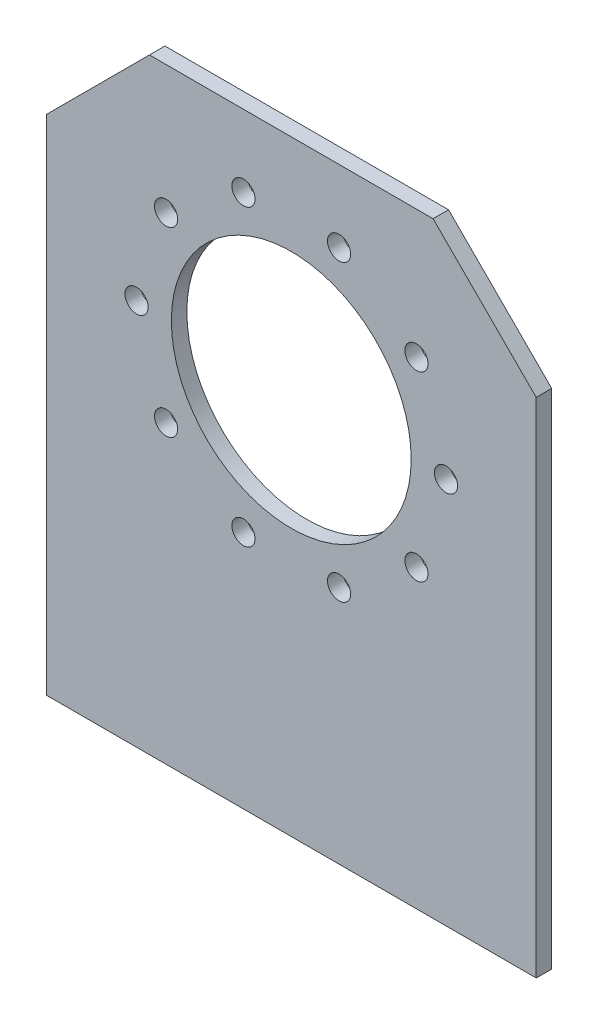
ISO-10303-21;
HEADER;
FILE_DESCRIPTION(('STEP AP214'),'2;1');
FILE_NAME('part.step','',(''),(''),'','','');
FILE_SCHEMA(('AUTOMOTIVE_DESIGN { 1 0 10303 214 1 1 1 1 }'));
ENDSEC;
DATA;
#1=APPLICATION_CONTEXT('core data for automotive mechanical design processes');
#2=APPLICATION_PROTOCOL_DEFINITION('international standard','automotive_design',2000,#1);
#3=PRODUCT_CONTEXT('',#1,'mechanical');
#4=PRODUCT('Part','Part','',(#3));
#5=PRODUCT_RELATED_PRODUCT_CATEGORY('part','',(#4));
#6=PRODUCT_DEFINITION_FORMATION('','',#4);
#7=PRODUCT_DEFINITION_CONTEXT('part definition',#1,'design');
#8=PRODUCT_DEFINITION('design','',#6,#7);
#9=PRODUCT_DEFINITION_SHAPE('','',#8);
#10=(LENGTH_UNIT() NAMED_UNIT(*) SI_UNIT(.MILLI.,.METRE.));
#11=(NAMED_UNIT(*) PLANE_ANGLE_UNIT() SI_UNIT($,.RADIAN.));
#12=(NAMED_UNIT(*) SI_UNIT($,.STERADIAN.) SOLID_ANGLE_UNIT());
#13=UNCERTAINTY_MEASURE_WITH_UNIT(LENGTH_MEASURE(1.E-05),#10,'distance_accuracy_value','');
#14=(GEOMETRIC_REPRESENTATION_CONTEXT(3) GLOBAL_UNCERTAINTY_ASSIGNED_CONTEXT((#13)) GLOBAL_UNIT_ASSIGNED_CONTEXT((#10,
#11,#12)) REPRESENTATION_CONTEXT('',''));
#15=CARTESIAN_POINT('',(0.,0.,0.));
#16=DIRECTION('',(0.,0.,1.));
#17=DIRECTION('',(1.,0.,0.));
#18=AXIS2_PLACEMENT_3D('',#15,#16,#17);
#19=CARTESIAN_POINT('',(0.,0.,6.));
#20=DIRECTION('',(0.,0.,-1.));
#21=DIRECTION('',(-1.,0.,0.));
#22=AXIS2_PLACEMENT_3D('',#19,#20,#21);
#23=PLANE('',#22);
#24=DIRECTION('',(0.,-1.,0.));
#25=VECTOR('',#24,1.);
#26=CARTESIAN_POINT('',(-95.,-117.5,6.));
#27=LINE('',#26,#25);
#28=CARTESIAN_POINT('',(-95.,77.5,6.));
#29=VERTEX_POINT('',#28);
#30=CARTESIAN_POINT('',(-95.,-117.5,6.));
#31=VERTEX_POINT('',#30);
#32=EDGE_CURVE('E152',#29,#31,#27,.T.);
#33=ORIENTED_EDGE('',*,*,#32,.T.);
#34=DIRECTION('',(1.,0.,0.));
#35=VECTOR('',#34,1.);
#36=CARTESIAN_POINT('',(-95.,-117.5,6.));
#37=LINE('',#36,#35);
#38=CARTESIAN_POINT('',(95.,-117.5,6.));
#39=VERTEX_POINT('',#38);
#40=EDGE_CURVE('E100',#31,#39,#37,.T.);
#41=ORIENTED_EDGE('',*,*,#40,.T.);
#42=DIRECTION('',(0.,1.,0.));
#43=VECTOR('',#42,1.);
#44=CARTESIAN_POINT('',(95.,-117.5,6.));
#45=LINE('',#44,#43);
#46=CARTESIAN_POINT('',(95.,77.5,6.));
#47=VERTEX_POINT('',#46);
#48=EDGE_CURVE('E113',#39,#47,#45,.T.);
#49=ORIENTED_EDGE('',*,*,#48,.T.);
#50=DIRECTION('',(-0.707106781186547,0.707106781186548,0.));
#51=VECTOR('',#50,1.);
#52=CARTESIAN_POINT('',(55.,117.5,6.));
#53=LINE('',#52,#51);
#54=CARTESIAN_POINT('',(55.,117.5,6.));
#55=VERTEX_POINT('',#54);
#56=EDGE_CURVE('E107',#47,#55,#53,.T.);
#57=ORIENTED_EDGE('',*,*,#56,.T.);
#58=DIRECTION('',(-1.,0.,0.));
#59=VECTOR('',#58,1.);
#60=CARTESIAN_POINT('',(-55.,117.5,6.));
#61=LINE('',#60,#59);
#62=CARTESIAN_POINT('',(-55.,117.5,6.));
#63=VERTEX_POINT('',#62);
#64=EDGE_CURVE('E111',#55,#63,#61,.T.);
#65=ORIENTED_EDGE('',*,*,#64,.T.);
#66=DIRECTION('',(-0.707106781186548,-0.707106781186547,0.));
#67=VECTOR('',#66,1.);
#68=CARTESIAN_POINT('',(-95.,77.5,6.));
#69=LINE('',#68,#67);
#70=EDGE_CURVE('E63',#63,#29,#69,.T.);
#71=ORIENTED_EDGE('',*,*,#70,.T.);
#72=EDGE_LOOP('',(#33,#41,#49,#57,#65,#71));
#73=FACE_BOUND('',#72,.T.);
#74=CARTESIAN_POINT('',(-60.,32.5,6.));
#75=DIRECTION('',(0.,0.,1.));
#76=DIRECTION('',(1.,0.,0.));
#77=AXIS2_PLACEMENT_3D('',#74,#75,#76);
#78=CIRCLE('',#77,4.50000000000001);
#79=CARTESIAN_POINT('',(-55.5,32.5,6.));
#80=VERTEX_POINT('',#79);
#81=EDGE_CURVE('E140',#80,#80,#78,.T.);
#82=ORIENTED_EDGE('',*,*,#81,.F.);
#83=EDGE_LOOP('',(#82));
#84=FACE_BOUND('',#83,.T.);
#85=CARTESIAN_POINT('',(0.,32.5,6.));
#86=DIRECTION('',(0.,0.,1.));
#87=DIRECTION('',(1.,0.,0.));
#88=AXIS2_PLACEMENT_3D('',#85,#86,#87);
#89=CIRCLE('',#88,46.5);
#90=CARTESIAN_POINT('',(46.5,32.5,6.));
#91=VERTEX_POINT('',#90);
#92=EDGE_CURVE('E308',#91,#91,#89,.T.);
#93=ORIENTED_EDGE('',*,*,#92,.F.);
#94=EDGE_LOOP('',(#93));
#95=FACE_BOUND('',#94,.T.);
#96=CARTESIAN_POINT('',(-48.5410196624968,67.7671151375484,6.));
#97=DIRECTION('',(0.,0.,1.));
#98=DIRECTION('',(1.,0.,0.));
#99=AXIS2_PLACEMENT_3D('',#96,#97,#98);
#100=CIRCLE('',#99,4.50000000000001);
#101=CARTESIAN_POINT('',(-44.0410196624968,67.7671151375484,6.));
#102=VERTEX_POINT('',#101);
#103=EDGE_CURVE('E300',#102,#102,#100,.T.);
#104=ORIENTED_EDGE('',*,*,#103,.F.);
#105=EDGE_LOOP('',(#104));
#106=FACE_BOUND('',#105,.T.);
#107=CARTESIAN_POINT('',(-18.5410196624968,89.5633909777092,6.));
#108=DIRECTION('',(0.,0.,1.));
#109=DIRECTION('',(1.,0.,0.));
#110=AXIS2_PLACEMENT_3D('',#107,#108,#109);
#111=CIRCLE('',#110,4.50000000000001);
#112=CARTESIAN_POINT('',(-14.0410196624968,89.5633909777092,6.));
#113=VERTEX_POINT('',#112);
#114=EDGE_CURVE('E292',#113,#113,#111,.T.);
#115=ORIENTED_EDGE('',*,*,#114,.F.);
#116=EDGE_LOOP('',(#115));
#117=FACE_BOUND('',#116,.T.);
#118=CARTESIAN_POINT('',(18.5410196624968,89.5633909777092,6.));
#119=DIRECTION('',(0.,0.,1.));
#120=DIRECTION('',(1.,0.,0.));
#121=AXIS2_PLACEMENT_3D('',#118,#119,#120);
#122=CIRCLE('',#121,4.50000000000001);
#123=CARTESIAN_POINT('',(23.0410196624969,89.5633909777092,6.));
#124=VERTEX_POINT('',#123);
#125=EDGE_CURVE('E284',#124,#124,#122,.T.);
#126=ORIENTED_EDGE('',*,*,#125,.F.);
#127=EDGE_LOOP('',(#126));
#128=FACE_BOUND('',#127,.T.);
#129=CARTESIAN_POINT('',(48.5410196624968,67.7671151375484,6.));
#130=DIRECTION('',(0.,0.,1.));
#131=DIRECTION('',(1.,0.,0.));
#132=AXIS2_PLACEMENT_3D('',#129,#130,#131);
#133=CIRCLE('',#132,4.50000000000001);
#134=CARTESIAN_POINT('',(53.0410196624969,67.7671151375484,6.));
#135=VERTEX_POINT('',#134);
#136=EDGE_CURVE('E276',#135,#135,#133,.T.);
#137=ORIENTED_EDGE('',*,*,#136,.F.);
#138=EDGE_LOOP('',(#137));
#139=FACE_BOUND('',#138,.T.);
#140=CARTESIAN_POINT('',(60.,32.5,6.));
#141=DIRECTION('',(0.,0.,1.));
#142=DIRECTION('',(1.,0.,0.));
#143=AXIS2_PLACEMENT_3D('',#140,#141,#142);
#144=CIRCLE('',#143,4.50000000000002);
#145=CARTESIAN_POINT('',(64.5,32.5,6.));
#146=VERTEX_POINT('',#145);
#147=EDGE_CURVE('E268',#146,#146,#144,.T.);
#148=ORIENTED_EDGE('',*,*,#147,.F.);
#149=EDGE_LOOP('',(#148));
#150=FACE_BOUND('',#149,.T.);
#151=CARTESIAN_POINT('',(48.5410196624969,-2.76711513754838,6.));
#152=DIRECTION('',(0.,0.,1.));
#153=DIRECTION('',(1.,0.,0.));
#154=AXIS2_PLACEMENT_3D('',#151,#152,#153);
#155=CIRCLE('',#154,4.5);
#156=CARTESIAN_POINT('',(53.0410196624969,-2.76711513754838,6.));
#157=VERTEX_POINT('',#156);
#158=EDGE_CURVE('E260',#157,#157,#155,.T.);
#159=ORIENTED_EDGE('',*,*,#158,.F.);
#160=EDGE_LOOP('',(#159));
#161=FACE_BOUND('',#160,.T.);
#162=CARTESIAN_POINT('',(18.5410196624969,-24.5633909777092,6.));
#163=DIRECTION('',(0.,0.,1.));
#164=DIRECTION('',(1.,0.,0.));
#165=AXIS2_PLACEMENT_3D('',#162,#163,#164);
#166=CIRCLE('',#165,4.5);
#167=CARTESIAN_POINT('',(23.0410196624969,-24.5633909777092,6.));
#168=VERTEX_POINT('',#167);
#169=EDGE_CURVE('E252',#168,#168,#166,.T.);
#170=ORIENTED_EDGE('',*,*,#169,.F.);
#171=EDGE_LOOP('',(#170));
#172=FACE_BOUND('',#171,.T.);
#173=CARTESIAN_POINT('',(-18.5410196624968,-24.5633909777092,6.));
#174=DIRECTION('',(0.,0.,1.));
#175=DIRECTION('',(1.,0.,0.));
#176=AXIS2_PLACEMENT_3D('',#173,#174,#175);
#177=CIRCLE('',#176,4.5);
#178=CARTESIAN_POINT('',(-14.0410196624968,-24.5633909777092,6.));
#179=VERTEX_POINT('',#178);
#180=EDGE_CURVE('E244',#179,#179,#177,.T.);
#181=ORIENTED_EDGE('',*,*,#180,.F.);
#182=EDGE_LOOP('',(#181));
#183=FACE_BOUND('',#182,.T.);
#184=CARTESIAN_POINT('',(-48.5410196624968,-2.7671151375484,6.));
#185=DIRECTION('',(0.,0.,1.));
#186=DIRECTION('',(1.,0.,0.));
#187=AXIS2_PLACEMENT_3D('',#184,#185,#186);
#188=CIRCLE('',#187,4.50000000000001);
#189=CARTESIAN_POINT('',(-44.0410196624968,-2.7671151375484,6.));
#190=VERTEX_POINT('',#189);
#191=EDGE_CURVE('E233',#190,#190,#188,.T.);
#192=ORIENTED_EDGE('',*,*,#191,.F.);
#193=EDGE_LOOP('',(#192));
#194=FACE_BOUND('',#193,.T.);
#195=ADVANCED_FACE('F45',(#73,#84,#95,#106,#117,#128,#139,#150,#161,#172,#183,#194),#23,.F.);
#196=CARTESIAN_POINT('',(0.,0.,0.));
#197=DIRECTION('',(0.,0.,-1.));
#198=DIRECTION('',(-1.,0.,0.));
#199=AXIS2_PLACEMENT_3D('',#196,#197,#198);
#200=PLANE('',#199);
#201=CARTESIAN_POINT('',(-18.5410196624968,-24.5633909777092,0.));
#202=DIRECTION('',(0.,0.,1.));
#203=DIRECTION('',(1.,0.,0.));
#204=AXIS2_PLACEMENT_3D('',#201,#202,#203);
#205=CIRCLE('',#204,4.5);
#206=CARTESIAN_POINT('',(-14.0410196624968,-24.5633909777092,0.));
#207=VERTEX_POINT('',#206);
#208=EDGE_CURVE('E241',#207,#207,#205,.T.);
#209=ORIENTED_EDGE('',*,*,#208,.T.);
#210=EDGE_LOOP('',(#209));
#211=FACE_BOUND('',#210,.T.);
#212=CARTESIAN_POINT('',(48.5410196624969,-2.76711513754838,0.));
#213=DIRECTION('',(0.,0.,1.));
#214=DIRECTION('',(1.,0.,0.));
#215=AXIS2_PLACEMENT_3D('',#212,#213,#214);
#216=CIRCLE('',#215,4.5);
#217=CARTESIAN_POINT('',(53.0410196624969,-2.76711513754838,0.));
#218=VERTEX_POINT('',#217);
#219=EDGE_CURVE('E256',#218,#218,#216,.T.);
#220=ORIENTED_EDGE('',*,*,#219,.T.);
#221=EDGE_LOOP('',(#220));
#222=FACE_BOUND('',#221,.T.);
#223=CARTESIAN_POINT('',(48.5410196624968,67.7671151375484,0.));
#224=DIRECTION('',(0.,0.,1.));
#225=DIRECTION('',(1.,0.,0.));
#226=AXIS2_PLACEMENT_3D('',#223,#224,#225);
#227=CIRCLE('',#226,4.50000000000001);
#228=CARTESIAN_POINT('',(53.0410196624969,67.7671151375484,0.));
#229=VERTEX_POINT('',#228);
#230=EDGE_CURVE('E272',#229,#229,#227,.T.);
#231=ORIENTED_EDGE('',*,*,#230,.T.);
#232=EDGE_LOOP('',(#231));
#233=FACE_BOUND('',#232,.T.);
#234=CARTESIAN_POINT('',(-18.5410196624968,89.5633909777092,0.));
#235=DIRECTION('',(0.,0.,1.));
#236=DIRECTION('',(1.,0.,0.));
#237=AXIS2_PLACEMENT_3D('',#234,#235,#236);
#238=CIRCLE('',#237,4.50000000000001);
#239=CARTESIAN_POINT('',(-14.0410196624968,89.5633909777092,0.));
#240=VERTEX_POINT('',#239);
#241=EDGE_CURVE('E288',#240,#240,#238,.T.);
#242=ORIENTED_EDGE('',*,*,#241,.T.);
#243=EDGE_LOOP('',(#242));
#244=FACE_BOUND('',#243,.T.);
#245=CARTESIAN_POINT('',(0.,32.5,0.));
#246=DIRECTION('',(0.,0.,1.));
#247=DIRECTION('',(1.,0.,0.));
#248=AXIS2_PLACEMENT_3D('',#245,#246,#247);
#249=CIRCLE('',#248,46.5);
#250=CARTESIAN_POINT('',(46.5,32.5,0.));
#251=VERTEX_POINT('',#250);
#252=EDGE_CURVE('E304',#251,#251,#249,.T.);
#253=ORIENTED_EDGE('',*,*,#252,.T.);
#254=EDGE_LOOP('',(#253));
#255=FACE_BOUND('',#254,.T.);
#256=DIRECTION('',(0.,-1.,0.));
#257=VECTOR('',#256,1.);
#258=CARTESIAN_POINT('',(-95.,-117.5,0.));
#259=LINE('',#258,#257);
#260=CARTESIAN_POINT('',(-95.,77.5,0.));
#261=VERTEX_POINT('',#260);
#262=CARTESIAN_POINT('',(-95.,-117.5,0.));
#263=VERTEX_POINT('',#262);
#264=EDGE_CURVE('E135',#261,#263,#259,.T.);
#265=ORIENTED_EDGE('',*,*,#264,.F.);
#266=DIRECTION('',(-0.707106781186548,-0.707106781186547,0.));
#267=VECTOR('',#266,1.);
#268=CARTESIAN_POINT('',(-95.,77.5,0.));
#269=LINE('',#268,#267);
#270=CARTESIAN_POINT('',(-55.,117.5,0.));
#271=VERTEX_POINT('',#270);
#272=EDGE_CURVE('E92',#271,#261,#269,.T.);
#273=ORIENTED_EDGE('',*,*,#272,.F.);
#274=DIRECTION('',(-1.,0.,0.));
#275=VECTOR('',#274,1.);
#276=CARTESIAN_POINT('',(-55.,117.5,0.));
#277=LINE('',#276,#275);
#278=CARTESIAN_POINT('',(55.,117.5,0.));
#279=VERTEX_POINT('',#278);
#280=EDGE_CURVE('E86',#279,#271,#277,.T.);
#281=ORIENTED_EDGE('',*,*,#280,.F.);
#282=DIRECTION('',(-0.707106781186547,0.707106781186548,0.));
#283=VECTOR('',#282,1.);
#284=CARTESIAN_POINT('',(55.,117.5,0.));
#285=LINE('',#284,#283);
#286=CARTESIAN_POINT('',(95.,77.5,0.));
#287=VERTEX_POINT('',#286);
#288=EDGE_CURVE('E122',#287,#279,#285,.T.);
#289=ORIENTED_EDGE('',*,*,#288,.F.);
#290=DIRECTION('',(0.,1.,0.));
#291=VECTOR('',#290,1.);
#292=CARTESIAN_POINT('',(95.,-117.5,0.));
#293=LINE('',#292,#291);
#294=CARTESIAN_POINT('',(95.,-117.5,0.));
#295=VERTEX_POINT('',#294);
#296=EDGE_CURVE('E143',#295,#287,#293,.T.);
#297=ORIENTED_EDGE('',*,*,#296,.F.);
#298=DIRECTION('',(1.,0.,0.));
#299=VECTOR('',#298,1.);
#300=CARTESIAN_POINT('',(-95.,-117.5,0.));
#301=LINE('',#300,#299);
#302=EDGE_CURVE('E139',#263,#295,#301,.T.);
#303=ORIENTED_EDGE('',*,*,#302,.F.);
#304=EDGE_LOOP('',(#265,#273,#281,#289,#297,#303));
#305=FACE_BOUND('',#304,.T.);
#306=CARTESIAN_POINT('',(-60.,32.5,0.));
#307=DIRECTION('',(0.,0.,1.));
#308=DIRECTION('',(1.,0.,0.));
#309=AXIS2_PLACEMENT_3D('',#306,#307,#308);
#310=CIRCLE('',#309,4.50000000000001);
#311=CARTESIAN_POINT('',(-55.5,32.5,0.));
#312=VERTEX_POINT('',#311);
#313=EDGE_CURVE('E312',#312,#312,#310,.T.);
#314=ORIENTED_EDGE('',*,*,#313,.T.);
#315=EDGE_LOOP('',(#314));
#316=FACE_BOUND('',#315,.T.);
#317=CARTESIAN_POINT('',(-48.5410196624968,67.7671151375484,0.));
#318=DIRECTION('',(0.,0.,1.));
#319=DIRECTION('',(1.,0.,0.));
#320=AXIS2_PLACEMENT_3D('',#317,#318,#319);
#321=CIRCLE('',#320,4.50000000000001);
#322=CARTESIAN_POINT('',(-44.0410196624968,67.7671151375484,0.));
#323=VERTEX_POINT('',#322);
#324=EDGE_CURVE('E296',#323,#323,#321,.T.);
#325=ORIENTED_EDGE('',*,*,#324,.T.);
#326=EDGE_LOOP('',(#325));
#327=FACE_BOUND('',#326,.T.);
#328=CARTESIAN_POINT('',(18.5410196624968,89.5633909777092,0.));
#329=DIRECTION('',(0.,0.,1.));
#330=DIRECTION('',(1.,0.,0.));
#331=AXIS2_PLACEMENT_3D('',#328,#329,#330);
#332=CIRCLE('',#331,4.50000000000001);
#333=CARTESIAN_POINT('',(23.0410196624969,89.5633909777092,0.));
#334=VERTEX_POINT('',#333);
#335=EDGE_CURVE('E280',#334,#334,#332,.T.);
#336=ORIENTED_EDGE('',*,*,#335,.T.);
#337=EDGE_LOOP('',(#336));
#338=FACE_BOUND('',#337,.T.);
#339=CARTESIAN_POINT('',(60.,32.5,0.));
#340=DIRECTION('',(0.,0.,1.));
#341=DIRECTION('',(1.,0.,0.));
#342=AXIS2_PLACEMENT_3D('',#339,#340,#341);
#343=CIRCLE('',#342,4.50000000000002);
#344=CARTESIAN_POINT('',(64.5,32.5,0.));
#345=VERTEX_POINT('',#344);
#346=EDGE_CURVE('E264',#345,#345,#343,.T.);
#347=ORIENTED_EDGE('',*,*,#346,.T.);
#348=EDGE_LOOP('',(#347));
#349=FACE_BOUND('',#348,.T.);
#350=CARTESIAN_POINT('',(18.5410196624969,-24.5633909777092,0.));
#351=DIRECTION('',(0.,0.,1.));
#352=DIRECTION('',(1.,0.,0.));
#353=AXIS2_PLACEMENT_3D('',#350,#351,#352);
#354=CIRCLE('',#353,4.5);
#355=CARTESIAN_POINT('',(23.0410196624969,-24.5633909777092,0.));
#356=VERTEX_POINT('',#355);
#357=EDGE_CURVE('E248',#356,#356,#354,.T.);
#358=ORIENTED_EDGE('',*,*,#357,.T.);
#359=EDGE_LOOP('',(#358));
#360=FACE_BOUND('',#359,.T.);
#361=CARTESIAN_POINT('',(-48.5410196624968,-2.7671151375484,0.));
#362=DIRECTION('',(0.,0.,1.));
#363=DIRECTION('',(1.,0.,0.));
#364=AXIS2_PLACEMENT_3D('',#361,#362,#363);
#365=CIRCLE('',#364,4.50000000000001);
#366=CARTESIAN_POINT('',(-44.0410196624968,-2.7671151375484,0.));
#367=VERTEX_POINT('',#366);
#368=EDGE_CURVE('E236',#367,#367,#365,.T.);
#369=ORIENTED_EDGE('',*,*,#368,.T.);
#370=EDGE_LOOP('',(#369));
#371=FACE_BOUND('',#370,.T.);
#372=ADVANCED_FACE('F165',(#211,#222,#233,#244,#255,#305,#316,#327,#338,#349,#360,#371),#200,.T.);
#373=CARTESIAN_POINT('',(-95.,-117.5,6.));
#374=DIRECTION('',(1.,0.,0.));
#375=DIRECTION('',(0.,1.,0.));
#376=AXIS2_PLACEMENT_3D('',#373,#374,#375);
#377=PLANE('',#376);
#378=ORIENTED_EDGE('',*,*,#264,.T.);
#379=DIRECTION('',(0.,0.,-1.));
#380=VECTOR('',#379,1.);
#381=CARTESIAN_POINT('',(-95.,-117.5,6.));
#382=LINE('',#381,#380);
#383=EDGE_CURVE('E11',#31,#263,#382,.T.);
#384=ORIENTED_EDGE('',*,*,#383,.F.);
#385=ORIENTED_EDGE('',*,*,#32,.F.);
#386=DIRECTION('',(0.,0.,-1.));
#387=VECTOR('',#386,1.);
#388=CARTESIAN_POINT('',(-95.,77.5,6.));
#389=LINE('',#388,#387);
#390=EDGE_CURVE('E131',#29,#261,#389,.T.);
#391=ORIENTED_EDGE('',*,*,#390,.T.);
#392=EDGE_LOOP('',(#378,#384,#385,#391));
#393=FACE_BOUND('',#392,.T.);
#394=ADVANCED_FACE('F47',(#393),#377,.F.);
#395=CARTESIAN_POINT('',(-95.,-117.5,6.));
#396=DIRECTION('',(0.,1.,0.));
#397=DIRECTION('',(-1.,0.,0.));
#398=AXIS2_PLACEMENT_3D('',#395,#396,#397);
#399=PLANE('',#398);
#400=ORIENTED_EDGE('',*,*,#302,.T.);
#401=DIRECTION('',(0.,0.,-1.));
#402=VECTOR('',#401,1.);
#403=CARTESIAN_POINT('',(95.,-117.5,6.));
#404=LINE('',#403,#402);
#405=EDGE_CURVE('E55',#39,#295,#404,.T.);
#406=ORIENTED_EDGE('',*,*,#405,.F.);
#407=ORIENTED_EDGE('',*,*,#40,.F.);
#408=ORIENTED_EDGE('',*,*,#383,.T.);
#409=EDGE_LOOP('',(#400,#406,#407,#408));
#410=FACE_BOUND('',#409,.T.);
#411=ADVANCED_FACE('F445',(#410),#399,.F.);
#412=CARTESIAN_POINT('',(95.,-117.5,6.));
#413=DIRECTION('',(-1.,0.,0.));
#414=DIRECTION('',(0.,0.,1.));
#415=AXIS2_PLACEMENT_3D('',#412,#413,#414);
#416=PLANE('',#415);
#417=ORIENTED_EDGE('',*,*,#296,.T.);
#418=DIRECTION('',(0.,0.,-1.));
#419=VECTOR('',#418,1.);
#420=CARTESIAN_POINT('',(95.,77.5,6.));
#421=LINE('',#420,#419);
#422=EDGE_CURVE('E124',#47,#287,#421,.T.);
#423=ORIENTED_EDGE('',*,*,#422,.F.);
#424=ORIENTED_EDGE('',*,*,#48,.F.);
#425=ORIENTED_EDGE('',*,*,#405,.T.);
#426=EDGE_LOOP('',(#417,#423,#424,#425));
#427=FACE_BOUND('',#426,.T.);
#428=ADVANCED_FACE('F162',(#427),#416,.F.);
#429=CARTESIAN_POINT('',(55.,117.5,6.));
#430=DIRECTION('',(-0.707106781186548,-0.707106781186547,0.));
#431=DIRECTION('',(0.707106781186547,-0.707106781186548,0.));
#432=AXIS2_PLACEMENT_3D('',#429,#430,#431);
#433=PLANE('',#432);
#434=ORIENTED_EDGE('',*,*,#288,.T.);
#435=DIRECTION('',(0.,0.,-1.));
#436=VECTOR('',#435,1.);
#437=CARTESIAN_POINT('',(55.,117.5,6.));
#438=LINE('',#437,#436);
#439=EDGE_CURVE('E119',#55,#279,#438,.T.);
#440=ORIENTED_EDGE('',*,*,#439,.F.);
#441=ORIENTED_EDGE('',*,*,#56,.F.);
#442=ORIENTED_EDGE('',*,*,#422,.T.);
#443=EDGE_LOOP('',(#434,#440,#441,#442));
#444=FACE_BOUND('',#443,.T.);
#445=ADVANCED_FACE('F120',(#444),#433,.F.);
#446=CARTESIAN_POINT('',(-55.,117.5,6.));
#447=DIRECTION('',(0.,-1.,0.));
#448=DIRECTION('',(0.,0.,-1.));
#449=AXIS2_PLACEMENT_3D('',#446,#447,#448);
#450=PLANE('',#449);
#451=ORIENTED_EDGE('',*,*,#280,.T.);
#452=DIRECTION('',(0.,0.,-1.));
#453=VECTOR('',#452,1.);
#454=CARTESIAN_POINT('',(-55.,117.5,6.));
#455=LINE('',#454,#453);
#456=EDGE_CURVE('E125',#63,#271,#455,.T.);
#457=ORIENTED_EDGE('',*,*,#456,.F.);
#458=ORIENTED_EDGE('',*,*,#64,.F.);
#459=ORIENTED_EDGE('',*,*,#439,.T.);
#460=EDGE_LOOP('',(#451,#457,#458,#459));
#461=FACE_BOUND('',#460,.T.);
#462=ADVANCED_FACE('F127',(#461),#450,.F.);
#463=CARTESIAN_POINT('',(-95.,77.5,6.));
#464=DIRECTION('',(0.707106781186547,-0.707106781186548,0.));
#465=DIRECTION('',(0.707106781186548,0.707106781186547,0.));
#466=AXIS2_PLACEMENT_3D('',#463,#464,#465);
#467=PLANE('',#466);
#468=ORIENTED_EDGE('',*,*,#272,.T.);
#469=ORIENTED_EDGE('',*,*,#390,.F.);
#470=ORIENTED_EDGE('',*,*,#70,.F.);
#471=ORIENTED_EDGE('',*,*,#456,.T.);
#472=EDGE_LOOP('',(#468,#469,#470,#471));
#473=FACE_BOUND('',#472,.T.);
#474=ADVANCED_FACE('F170',(#473),#467,.F.);
#475=CARTESIAN_POINT('',(-60.,32.5,6.));
#476=DIRECTION('',(0.,0.,-1.));
#477=DIRECTION('',(-1.,0.,0.));
#478=AXIS2_PLACEMENT_3D('',#475,#476,#477);
#479=CYLINDRICAL_SURFACE('',#478,4.50000000000001);
#480=ORIENTED_EDGE('',*,*,#81,.T.);
#481=EDGE_LOOP('',(#480));
#482=FACE_BOUND('',#481,.T.);
#483=ORIENTED_EDGE('',*,*,#313,.F.);
#484=EDGE_LOOP('',(#483));
#485=FACE_BOUND('',#484,.T.);
#486=ADVANCED_FACE('F172',(#482,#485),#479,.F.);
#487=CARTESIAN_POINT('',(0.,32.5,6.));
#488=DIRECTION('',(0.,0.,-1.));
#489=DIRECTION('',(-1.,0.,0.));
#490=AXIS2_PLACEMENT_3D('',#487,#488,#489);
#491=CYLINDRICAL_SURFACE('',#490,46.5);
#492=ORIENTED_EDGE('',*,*,#92,.T.);
#493=EDGE_LOOP('',(#492));
#494=FACE_BOUND('',#493,.T.);
#495=ORIENTED_EDGE('',*,*,#252,.F.);
#496=EDGE_LOOP('',(#495));
#497=FACE_BOUND('',#496,.T.);
#498=ADVANCED_FACE('F178',(#494,#497),#491,.F.);
#499=CARTESIAN_POINT('',(-48.5410196624968,67.7671151375484,6.));
#500=DIRECTION('',(0.,0.,-1.));
#501=DIRECTION('',(-1.,0.,0.));
#502=AXIS2_PLACEMENT_3D('',#499,#500,#501);
#503=CYLINDRICAL_SURFACE('',#502,4.50000000000001);
#504=ORIENTED_EDGE('',*,*,#103,.T.);
#505=EDGE_LOOP('',(#504));
#506=FACE_BOUND('',#505,.T.);
#507=ORIENTED_EDGE('',*,*,#324,.F.);
#508=EDGE_LOOP('',(#507));
#509=FACE_BOUND('',#508,.T.);
#510=ADVANCED_FACE('F192',(#506,#509),#503,.F.);
#511=CARTESIAN_POINT('',(-18.5410196624968,89.5633909777092,6.));
#512=DIRECTION('',(0.,0.,-1.));
#513=DIRECTION('',(-1.,0.,0.));
#514=AXIS2_PLACEMENT_3D('',#511,#512,#513);
#515=CYLINDRICAL_SURFACE('',#514,4.50000000000001);
#516=ORIENTED_EDGE('',*,*,#114,.T.);
#517=EDGE_LOOP('',(#516));
#518=FACE_BOUND('',#517,.T.);
#519=ORIENTED_EDGE('',*,*,#241,.F.);
#520=EDGE_LOOP('',(#519));
#521=FACE_BOUND('',#520,.T.);
#522=ADVANCED_FACE('F196',(#518,#521),#515,.F.);
#523=CARTESIAN_POINT('',(18.5410196624968,89.5633909777092,6.));
#524=DIRECTION('',(0.,0.,-1.));
#525=DIRECTION('',(-1.,0.,0.));
#526=AXIS2_PLACEMENT_3D('',#523,#524,#525);
#527=CYLINDRICAL_SURFACE('',#526,4.50000000000001);
#528=ORIENTED_EDGE('',*,*,#125,.T.);
#529=EDGE_LOOP('',(#528));
#530=FACE_BOUND('',#529,.T.);
#531=ORIENTED_EDGE('',*,*,#335,.F.);
#532=EDGE_LOOP('',(#531));
#533=FACE_BOUND('',#532,.T.);
#534=ADVANCED_FACE('F200',(#530,#533),#527,.F.);
#535=CARTESIAN_POINT('',(48.5410196624968,67.7671151375484,6.));
#536=DIRECTION('',(0.,0.,-1.));
#537=DIRECTION('',(-1.,0.,0.));
#538=AXIS2_PLACEMENT_3D('',#535,#536,#537);
#539=CYLINDRICAL_SURFACE('',#538,4.50000000000001);
#540=ORIENTED_EDGE('',*,*,#136,.T.);
#541=EDGE_LOOP('',(#540));
#542=FACE_BOUND('',#541,.T.);
#543=ORIENTED_EDGE('',*,*,#230,.F.);
#544=EDGE_LOOP('',(#543));
#545=FACE_BOUND('',#544,.T.);
#546=ADVANCED_FACE('F204',(#542,#545),#539,.F.);
#547=CARTESIAN_POINT('',(60.,32.5,6.));
#548=DIRECTION('',(0.,0.,-1.));
#549=DIRECTION('',(-1.,0.,0.));
#550=AXIS2_PLACEMENT_3D('',#547,#548,#549);
#551=CYLINDRICAL_SURFACE('',#550,4.50000000000002);
#552=ORIENTED_EDGE('',*,*,#147,.T.);
#553=EDGE_LOOP('',(#552));
#554=FACE_BOUND('',#553,.T.);
#555=ORIENTED_EDGE('',*,*,#346,.F.);
#556=EDGE_LOOP('',(#555));
#557=FACE_BOUND('',#556,.T.);
#558=ADVANCED_FACE('F208',(#554,#557),#551,.F.);
#559=CARTESIAN_POINT('',(48.5410196624969,-2.76711513754838,6.));
#560=DIRECTION('',(0.,0.,-1.));
#561=DIRECTION('',(-1.,0.,0.));
#562=AXIS2_PLACEMENT_3D('',#559,#560,#561);
#563=CYLINDRICAL_SURFACE('',#562,4.5);
#564=ORIENTED_EDGE('',*,*,#158,.T.);
#565=EDGE_LOOP('',(#564));
#566=FACE_BOUND('',#565,.T.);
#567=ORIENTED_EDGE('',*,*,#219,.F.);
#568=EDGE_LOOP('',(#567));
#569=FACE_BOUND('',#568,.T.);
#570=ADVANCED_FACE('F212',(#566,#569),#563,.F.);
#571=CARTESIAN_POINT('',(18.5410196624969,-24.5633909777092,6.));
#572=DIRECTION('',(0.,0.,-1.));
#573=DIRECTION('',(-1.,0.,0.));
#574=AXIS2_PLACEMENT_3D('',#571,#572,#573);
#575=CYLINDRICAL_SURFACE('',#574,4.5);
#576=ORIENTED_EDGE('',*,*,#169,.T.);
#577=EDGE_LOOP('',(#576));
#578=FACE_BOUND('',#577,.T.);
#579=ORIENTED_EDGE('',*,*,#357,.F.);
#580=EDGE_LOOP('',(#579));
#581=FACE_BOUND('',#580,.T.);
#582=ADVANCED_FACE('F216',(#578,#581),#575,.F.);
#583=CARTESIAN_POINT('',(-18.5410196624968,-24.5633909777092,6.));
#584=DIRECTION('',(0.,0.,-1.));
#585=DIRECTION('',(-1.,0.,0.));
#586=AXIS2_PLACEMENT_3D('',#583,#584,#585);
#587=CYLINDRICAL_SURFACE('',#586,4.5);
#588=ORIENTED_EDGE('',*,*,#180,.T.);
#589=EDGE_LOOP('',(#588));
#590=FACE_BOUND('',#589,.T.);
#591=ORIENTED_EDGE('',*,*,#208,.F.);
#592=EDGE_LOOP('',(#591));
#593=FACE_BOUND('',#592,.T.);
#594=ADVANCED_FACE('F220',(#590,#593),#587,.F.);
#595=CARTESIAN_POINT('',(-48.5410196624968,-2.7671151375484,6.));
#596=DIRECTION('',(0.,0.,-1.));
#597=DIRECTION('',(-1.,0.,0.));
#598=AXIS2_PLACEMENT_3D('',#595,#596,#597);
#599=CYLINDRICAL_SURFACE('',#598,4.50000000000001);
#600=ORIENTED_EDGE('',*,*,#191,.T.);
#601=EDGE_LOOP('',(#600));
#602=FACE_BOUND('',#601,.T.);
#603=ORIENTED_EDGE('',*,*,#368,.F.);
#604=EDGE_LOOP('',(#603));
#605=FACE_BOUND('',#604,.T.);
#606=ADVANCED_FACE('F224',(#602,#605),#599,.F.);
#607=CLOSED_SHELL('',(#195,#372,#394,#411,#428,#445,#462,#474,#486,#498,#510,#522,#534,#546,
#558,#570,#582,#594,#606));
#608=MANIFOLD_SOLID_BREP('B2',#607);
#609=ADVANCED_BREP_SHAPE_REPRESENTATION('',(#18,#608),#14);
#610=SHAPE_DEFINITION_REPRESENTATION(#9,#609);
ENDSEC;
END-ISO-10303-21;
